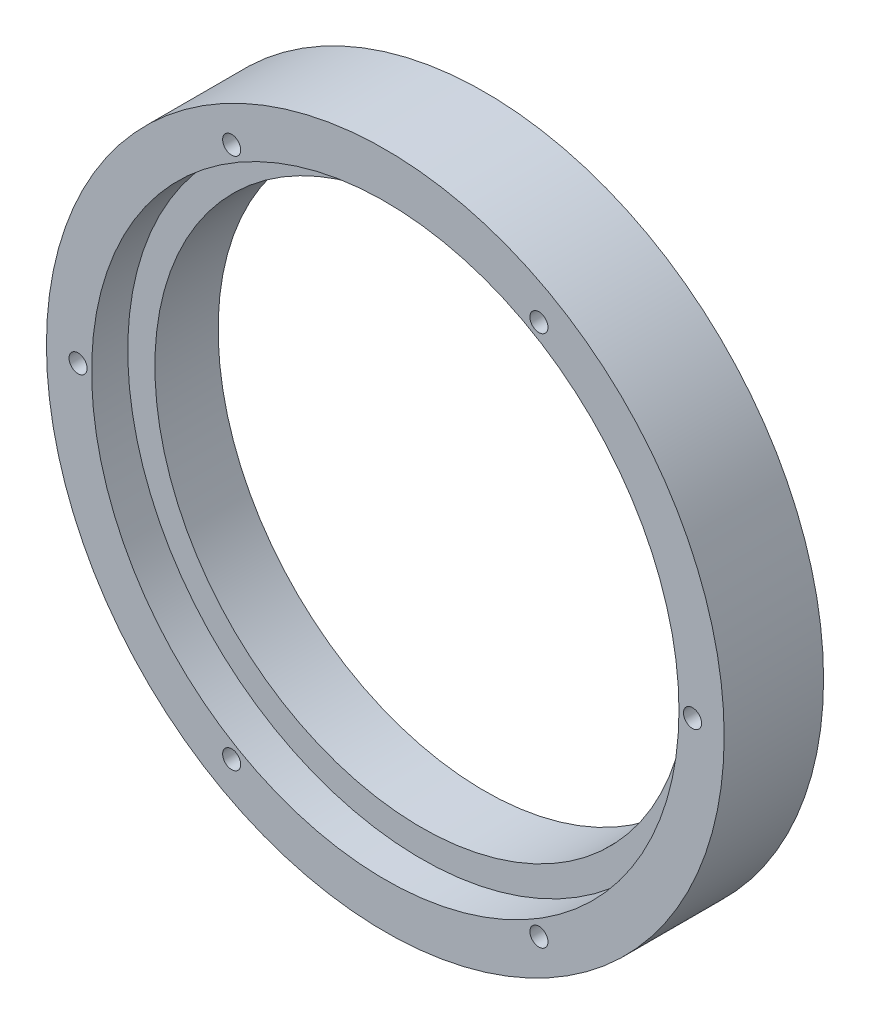
ISO-10303-21;
HEADER;
FILE_DESCRIPTION(('STEP AP214'),'2;1');
FILE_NAME('part.step','',(''),(''),'','','');
FILE_SCHEMA(('AUTOMOTIVE_DESIGN { 1 0 10303 214 1 1 1 1 }'));
ENDSEC;
DATA;
#1=APPLICATION_CONTEXT('core data for automotive mechanical design processes');
#2=APPLICATION_PROTOCOL_DEFINITION('international standard','automotive_design',2000,#1);
#3=PRODUCT_CONTEXT('',#1,'mechanical');
#4=PRODUCT('Part','Part','',(#3));
#5=PRODUCT_RELATED_PRODUCT_CATEGORY('part','',(#4));
#6=PRODUCT_DEFINITION_FORMATION('','',#4);
#7=PRODUCT_DEFINITION_CONTEXT('part definition',#1,'design');
#8=PRODUCT_DEFINITION('design','',#6,#7);
#9=PRODUCT_DEFINITION_SHAPE('','',#8);
#10=(LENGTH_UNIT() NAMED_UNIT(*) SI_UNIT(.MILLI.,.METRE.));
#11=(NAMED_UNIT(*) PLANE_ANGLE_UNIT() SI_UNIT($,.RADIAN.));
#12=(NAMED_UNIT(*) SI_UNIT($,.STERADIAN.) SOLID_ANGLE_UNIT());
#13=UNCERTAINTY_MEASURE_WITH_UNIT(LENGTH_MEASURE(1.E-05),#10,'distance_accuracy_value','');
#14=(GEOMETRIC_REPRESENTATION_CONTEXT(3) GLOBAL_UNCERTAINTY_ASSIGNED_CONTEXT((#13)) GLOBAL_UNIT_ASSIGNED_CONTEXT((#10,
#11,#12)) REPRESENTATION_CONTEXT('',''));
#15=CARTESIAN_POINT('',(0.,0.,0.));
#16=DIRECTION('',(0.,0.,1.));
#17=DIRECTION('',(1.,0.,0.));
#18=AXIS2_PLACEMENT_3D('',#15,#16,#17);
#19=CARTESIAN_POINT('',(0.,0.,11.));
#20=DIRECTION('',(0.,0.,-1.));
#21=DIRECTION('',(-1.,0.,0.));
#22=AXIS2_PLACEMENT_3D('',#19,#20,#21);
#23=CYLINDRICAL_SURFACE('',#22,29.5);
#24=CARTESIAN_POINT('',(0.,0.,0.));
#25=DIRECTION('',(0.,0.,1.));
#26=DIRECTION('',(1.,0.,0.));
#27=AXIS2_PLACEMENT_3D('',#24,#25,#26);
#28=CIRCLE('',#27,29.5);
#29=CARTESIAN_POINT('',(29.5,0.,0.));
#30=VERTEX_POINT('',#29);
#31=EDGE_CURVE('E47',#30,#30,#28,.T.);
#32=ORIENTED_EDGE('',*,*,#31,.F.);
#33=EDGE_LOOP('',(#32));
#34=FACE_BOUND('',#33,.T.);
#35=CARTESIAN_POINT('',(0.,0.,7.));
#36=DIRECTION('',(0.,0.,1.));
#37=DIRECTION('',(1.,0.,0.));
#38=AXIS2_PLACEMENT_3D('',#35,#36,#37);
#39=CIRCLE('',#38,29.5);
#40=CARTESIAN_POINT('',(29.5,0.,7.));
#41=VERTEX_POINT('',#40);
#42=EDGE_CURVE('E38',#41,#41,#39,.T.);
#43=ORIENTED_EDGE('',*,*,#42,.T.);
#44=EDGE_LOOP('',(#43));
#45=FACE_BOUND('',#44,.T.);
#46=ADVANCED_FACE('F34',(#34,#45),#23,.F.);
#47=CARTESIAN_POINT('',(0.,0.,11.));
#48=DIRECTION('',(0.,0.,1.));
#49=DIRECTION('',(1.,0.,0.));
#50=AXIS2_PLACEMENT_3D('',#47,#48,#49);
#51=PLANE('',#50);
#52=CARTESIAN_POINT('',(0.,0.,11.));
#53=DIRECTION('',(0.,0.,1.));
#54=DIRECTION('',(1.,0.,0.));
#55=AXIS2_PLACEMENT_3D('',#52,#53,#54);
#56=CIRCLE('',#55,32.5);
#57=CARTESIAN_POINT('',(32.5,0.,11.));
#58=VERTEX_POINT('',#57);
#59=EDGE_CURVE('E87',#58,#58,#56,.T.);
#60=ORIENTED_EDGE('',*,*,#59,.F.);
#61=EDGE_LOOP('',(#60));
#62=FACE_BOUND('',#61,.T.);
#63=CARTESIAN_POINT('',(34.,0.,11.));
#64=DIRECTION('',(0.,0.,-1.));
#65=DIRECTION('',(-1.,0.,0.));
#66=AXIS2_PLACEMENT_3D('',#63,#64,#65);
#67=CIRCLE('',#66,0.999999999999998);
#68=CARTESIAN_POINT('',(33.,0.,11.));
#69=VERTEX_POINT('',#68);
#70=EDGE_CURVE('E61',#69,#69,#67,.T.);
#71=ORIENTED_EDGE('',*,*,#70,.T.);
#72=EDGE_LOOP('',(#71));
#73=FACE_BOUND('',#72,.T.);
#74=CARTESIAN_POINT('',(17.0000000000001,-29.4448637286708,11.));
#75=DIRECTION('',(0.,0.,-1.));
#76=DIRECTION('',(-1.,0.,0.));
#77=AXIS2_PLACEMENT_3D('',#74,#75,#76);
#78=CIRCLE('',#77,1.);
#79=CARTESIAN_POINT('',(16.0000000000001,-29.4448637286708,11.));
#80=VERTEX_POINT('',#79);
#81=EDGE_CURVE('E67',#80,#80,#78,.T.);
#82=ORIENTED_EDGE('',*,*,#81,.T.);
#83=EDGE_LOOP('',(#82));
#84=FACE_BOUND('',#83,.T.);
#85=CARTESIAN_POINT('',(-17.0000000000002,-29.4448637286708,11.));
#86=DIRECTION('',(0.,0.,-1.));
#87=DIRECTION('',(-1.,0.,0.));
#88=AXIS2_PLACEMENT_3D('',#85,#86,#87);
#89=CIRCLE('',#88,1.);
#90=CARTESIAN_POINT('',(-18.0000000000002,-29.4448637286708,11.));
#91=VERTEX_POINT('',#90);
#92=EDGE_CURVE('E73',#91,#91,#89,.T.);
#93=ORIENTED_EDGE('',*,*,#92,.T.);
#94=EDGE_LOOP('',(#93));
#95=FACE_BOUND('',#94,.T.);
#96=CARTESIAN_POINT('',(-34.,0.,11.));
#97=DIRECTION('',(0.,0.,-1.));
#98=DIRECTION('',(-1.,0.,0.));
#99=AXIS2_PLACEMENT_3D('',#96,#97,#98);
#100=CIRCLE('',#99,0.999999999999998);
#101=CARTESIAN_POINT('',(-35.,0.,11.));
#102=VERTEX_POINT('',#101);
#103=EDGE_CURVE('E79',#102,#102,#100,.T.);
#104=ORIENTED_EDGE('',*,*,#103,.T.);
#105=EDGE_LOOP('',(#104));
#106=FACE_BOUND('',#105,.T.);
#107=CARTESIAN_POINT('',(-17.0000000000001,29.4448637286708,11.));
#108=DIRECTION('',(0.,0.,-1.));
#109=DIRECTION('',(-1.,0.,0.));
#110=AXIS2_PLACEMENT_3D('',#107,#108,#109);
#111=CIRCLE('',#110,1.00000000000001);
#112=CARTESIAN_POINT('',(-18.0000000000001,29.4448637286708,11.));
#113=VERTEX_POINT('',#112);
#114=EDGE_CURVE('E55',#113,#113,#111,.T.);
#115=ORIENTED_EDGE('',*,*,#114,.T.);
#116=EDGE_LOOP('',(#115));
#117=FACE_BOUND('',#116,.T.);
#118=CARTESIAN_POINT('',(17.0000000000001,29.4448637286708,11.));
#119=DIRECTION('',(0.,0.,-1.));
#120=DIRECTION('',(-1.,0.,0.));
#121=AXIS2_PLACEMENT_3D('',#118,#119,#120);
#122=CIRCLE('',#121,1.);
#123=CARTESIAN_POINT('',(16.0000000000001,29.4448637286708,11.));
#124=VERTEX_POINT('',#123);
#125=EDGE_CURVE('E51',#124,#124,#122,.T.);
#126=ORIENTED_EDGE('',*,*,#125,.T.);
#127=EDGE_LOOP('',(#126));
#128=FACE_BOUND('',#127,.T.);
#129=CARTESIAN_POINT('',(0.,0.,11.));
#130=DIRECTION('',(0.,0.,1.));
#131=DIRECTION('',(1.,0.,0.));
#132=AXIS2_PLACEMENT_3D('',#129,#130,#131);
#133=CIRCLE('',#132,37.5);
#134=CARTESIAN_POINT('',(37.5,0.,11.));
#135=VERTEX_POINT('',#134);
#136=EDGE_CURVE('E10',#135,#135,#133,.T.);
#137=ORIENTED_EDGE('',*,*,#136,.T.);
#138=EDGE_LOOP('',(#137));
#139=FACE_BOUND('',#138,.T.);
#140=ADVANCED_FACE('F109',(#62,#73,#84,#95,#106,#117,#128,#139),#51,.T.);
#141=CARTESIAN_POINT('',(0.,0.,0.));
#142=DIRECTION('',(0.,0.,1.));
#143=DIRECTION('',(1.,0.,0.));
#144=AXIS2_PLACEMENT_3D('',#141,#142,#143);
#145=PLANE('',#144);
#146=CARTESIAN_POINT('',(34.,0.,0.));
#147=DIRECTION('',(0.,0.,-1.));
#148=DIRECTION('',(-1.,0.,0.));
#149=AXIS2_PLACEMENT_3D('',#146,#147,#148);
#150=CIRCLE('',#149,0.999999999999998);
#151=CARTESIAN_POINT('',(33.,0.,0.));
#152=VERTEX_POINT('',#151);
#153=EDGE_CURVE('E58',#152,#152,#150,.T.);
#154=ORIENTED_EDGE('',*,*,#153,.F.);
#155=EDGE_LOOP('',(#154));
#156=FACE_BOUND('',#155,.T.);
#157=CARTESIAN_POINT('',(17.0000000000001,-29.4448637286708,0.));
#158=DIRECTION('',(0.,0.,-1.));
#159=DIRECTION('',(-1.,0.,0.));
#160=AXIS2_PLACEMENT_3D('',#157,#158,#159);
#161=CIRCLE('',#160,1.);
#162=CARTESIAN_POINT('',(16.0000000000001,-29.4448637286708,0.));
#163=VERTEX_POINT('',#162);
#164=EDGE_CURVE('E64',#163,#163,#161,.T.);
#165=ORIENTED_EDGE('',*,*,#164,.F.);
#166=EDGE_LOOP('',(#165));
#167=FACE_BOUND('',#166,.T.);
#168=CARTESIAN_POINT('',(-17.0000000000002,-29.4448637286708,0.));
#169=DIRECTION('',(0.,0.,-1.));
#170=DIRECTION('',(-1.,0.,0.));
#171=AXIS2_PLACEMENT_3D('',#168,#169,#170);
#172=CIRCLE('',#171,1.);
#173=CARTESIAN_POINT('',(-18.0000000000002,-29.4448637286708,0.));
#174=VERTEX_POINT('',#173);
#175=EDGE_CURVE('E70',#174,#174,#172,.T.);
#176=ORIENTED_EDGE('',*,*,#175,.F.);
#177=EDGE_LOOP('',(#176));
#178=FACE_BOUND('',#177,.T.);
#179=CARTESIAN_POINT('',(-34.,0.,0.));
#180=DIRECTION('',(0.,0.,-1.));
#181=DIRECTION('',(-1.,0.,0.));
#182=AXIS2_PLACEMENT_3D('',#179,#180,#181);
#183=CIRCLE('',#182,0.999999999999998);
#184=CARTESIAN_POINT('',(-35.,0.,0.));
#185=VERTEX_POINT('',#184);
#186=EDGE_CURVE('E76',#185,#185,#183,.T.);
#187=ORIENTED_EDGE('',*,*,#186,.F.);
#188=EDGE_LOOP('',(#187));
#189=FACE_BOUND('',#188,.T.);
#190=CARTESIAN_POINT('',(-17.0000000000001,29.4448637286708,0.));
#191=DIRECTION('',(0.,0.,-1.));
#192=DIRECTION('',(-1.,0.,0.));
#193=AXIS2_PLACEMENT_3D('',#190,#191,#192);
#194=CIRCLE('',#193,1.00000000000001);
#195=CARTESIAN_POINT('',(-18.0000000000001,29.4448637286708,0.));
#196=VERTEX_POINT('',#195);
#197=EDGE_CURVE('E82',#196,#196,#194,.T.);
#198=ORIENTED_EDGE('',*,*,#197,.F.);
#199=EDGE_LOOP('',(#198));
#200=FACE_BOUND('',#199,.T.);
#201=CARTESIAN_POINT('',(17.0000000000001,29.4448637286708,0.));
#202=DIRECTION('',(0.,0.,-1.));
#203=DIRECTION('',(-1.,0.,0.));
#204=AXIS2_PLACEMENT_3D('',#201,#202,#203);
#205=CIRCLE('',#204,1.);
#206=CARTESIAN_POINT('',(16.0000000000001,29.4448637286708,0.));
#207=VERTEX_POINT('',#206);
#208=EDGE_CURVE('E52',#207,#207,#205,.T.);
#209=ORIENTED_EDGE('',*,*,#208,.F.);
#210=EDGE_LOOP('',(#209));
#211=FACE_BOUND('',#210,.T.);
#212=CARTESIAN_POINT('',(0.,0.,0.));
#213=DIRECTION('',(0.,0.,1.));
#214=DIRECTION('',(1.,0.,0.));
#215=AXIS2_PLACEMENT_3D('',#212,#213,#214);
#216=CIRCLE('',#215,37.5);
#217=CARTESIAN_POINT('',(37.5,0.,0.));
#218=VERTEX_POINT('',#217);
#219=EDGE_CURVE('E42',#218,#218,#216,.T.);
#220=ORIENTED_EDGE('',*,*,#219,.F.);
#221=EDGE_LOOP('',(#220));
#222=FACE_BOUND('',#221,.T.);
#223=ORIENTED_EDGE('',*,*,#31,.T.);
#224=EDGE_LOOP('',(#223));
#225=FACE_BOUND('',#224,.T.);
#226=ADVANCED_FACE('F115',(#156,#167,#178,#189,#200,#211,#222,#225),#145,.F.);
#227=CARTESIAN_POINT('',(0.,0.,11.));
#228=DIRECTION('',(0.,0.,-1.));
#229=DIRECTION('',(-1.,0.,0.));
#230=AXIS2_PLACEMENT_3D('',#227,#228,#229);
#231=CYLINDRICAL_SURFACE('',#230,37.5);
#232=ORIENTED_EDGE('',*,*,#136,.F.);
#233=EDGE_LOOP('',(#232));
#234=FACE_BOUND('',#233,.T.);
#235=ORIENTED_EDGE('',*,*,#219,.T.);
#236=EDGE_LOOP('',(#235));
#237=FACE_BOUND('',#236,.T.);
#238=ADVANCED_FACE('F36',(#234,#237),#231,.T.);
#239=CARTESIAN_POINT('',(17.0000000000001,29.4448637286708,11.));
#240=DIRECTION('',(0.,0.,-1.));
#241=DIRECTION('',(-1.,0.,0.));
#242=AXIS2_PLACEMENT_3D('',#239,#240,#241);
#243=CYLINDRICAL_SURFACE('',#242,1.);
#244=ORIENTED_EDGE('',*,*,#125,.F.);
#245=EDGE_LOOP('',(#244));
#246=FACE_BOUND('',#245,.T.);
#247=ORIENTED_EDGE('',*,*,#208,.T.);
#248=EDGE_LOOP('',(#247));
#249=FACE_BOUND('',#248,.T.);
#250=ADVANCED_FACE('F120',(#246,#249),#243,.F.);
#251=CARTESIAN_POINT('',(-17.0000000000001,29.4448637286708,11.));
#252=DIRECTION('',(0.,0.,-1.));
#253=DIRECTION('',(-1.,0.,0.));
#254=AXIS2_PLACEMENT_3D('',#251,#252,#253);
#255=CYLINDRICAL_SURFACE('',#254,1.00000000000001);
#256=ORIENTED_EDGE('',*,*,#114,.F.);
#257=EDGE_LOOP('',(#256));
#258=FACE_BOUND('',#257,.T.);
#259=ORIENTED_EDGE('',*,*,#197,.T.);
#260=EDGE_LOOP('',(#259));
#261=FACE_BOUND('',#260,.T.);
#262=ADVANCED_FACE('F145',(#258,#261),#255,.F.);
#263=CARTESIAN_POINT('',(-34.,0.,11.));
#264=DIRECTION('',(0.,0.,-1.));
#265=DIRECTION('',(-1.,0.,0.));
#266=AXIS2_PLACEMENT_3D('',#263,#264,#265);
#267=CYLINDRICAL_SURFACE('',#266,0.999999999999998);
#268=ORIENTED_EDGE('',*,*,#103,.F.);
#269=EDGE_LOOP('',(#268));
#270=FACE_BOUND('',#269,.T.);
#271=ORIENTED_EDGE('',*,*,#186,.T.);
#272=EDGE_LOOP('',(#271));
#273=FACE_BOUND('',#272,.T.);
#274=ADVANCED_FACE('F150',(#270,#273),#267,.F.);
#275=CARTESIAN_POINT('',(-17.0000000000002,-29.4448637286708,11.));
#276=DIRECTION('',(0.,0.,-1.));
#277=DIRECTION('',(-1.,0.,0.));
#278=AXIS2_PLACEMENT_3D('',#275,#276,#277);
#279=CYLINDRICAL_SURFACE('',#278,1.);
#280=ORIENTED_EDGE('',*,*,#92,.F.);
#281=EDGE_LOOP('',(#280));
#282=FACE_BOUND('',#281,.T.);
#283=ORIENTED_EDGE('',*,*,#175,.T.);
#284=EDGE_LOOP('',(#283));
#285=FACE_BOUND('',#284,.T.);
#286=ADVANCED_FACE('F158',(#282,#285),#279,.F.);
#287=CARTESIAN_POINT('',(17.0000000000001,-29.4448637286708,11.));
#288=DIRECTION('',(0.,0.,-1.));
#289=DIRECTION('',(-1.,0.,0.));
#290=AXIS2_PLACEMENT_3D('',#287,#288,#289);
#291=CYLINDRICAL_SURFACE('',#290,1.);
#292=ORIENTED_EDGE('',*,*,#81,.F.);
#293=EDGE_LOOP('',(#292));
#294=FACE_BOUND('',#293,.T.);
#295=ORIENTED_EDGE('',*,*,#164,.T.);
#296=EDGE_LOOP('',(#295));
#297=FACE_BOUND('',#296,.T.);
#298=ADVANCED_FACE('F166',(#294,#297),#291,.F.);
#299=CARTESIAN_POINT('',(34.,0.,11.));
#300=DIRECTION('',(0.,0.,-1.));
#301=DIRECTION('',(-1.,0.,0.));
#302=AXIS2_PLACEMENT_3D('',#299,#300,#301);
#303=CYLINDRICAL_SURFACE('',#302,0.999999999999998);
#304=ORIENTED_EDGE('',*,*,#70,.F.);
#305=EDGE_LOOP('',(#304));
#306=FACE_BOUND('',#305,.T.);
#307=ORIENTED_EDGE('',*,*,#153,.T.);
#308=EDGE_LOOP('',(#307));
#309=FACE_BOUND('',#308,.T.);
#310=ADVANCED_FACE('F105',(#306,#309),#303,.F.);
#311=CARTESIAN_POINT('',(0.,0.,7.));
#312=DIRECTION('',(0.,0.,1.));
#313=DIRECTION('',(1.,0.,0.));
#314=AXIS2_PLACEMENT_3D('',#311,#312,#313);
#315=CYLINDRICAL_SURFACE('',#314,32.5);
#316=CARTESIAN_POINT('',(0.,0.,7.));
#317=DIRECTION('',(0.,0.,1.));
#318=DIRECTION('',(1.,0.,0.));
#319=AXIS2_PLACEMENT_3D('',#316,#317,#318);
#320=CIRCLE('',#319,32.5);
#321=CARTESIAN_POINT('',(32.5,0.,7.));
#322=VERTEX_POINT('',#321);
#323=EDGE_CURVE('E90',#322,#322,#320,.T.);
#324=ORIENTED_EDGE('',*,*,#323,.F.);
#325=EDGE_LOOP('',(#324));
#326=FACE_BOUND('',#325,.T.);
#327=ORIENTED_EDGE('',*,*,#59,.T.);
#328=EDGE_LOOP('',(#327));
#329=FACE_BOUND('',#328,.T.);
#330=ADVANCED_FACE('F100',(#326,#329),#315,.F.);
#331=CARTESIAN_POINT('',(0.,0.,7.));
#332=DIRECTION('',(0.,0.,1.));
#333=DIRECTION('',(1.,0.,0.));
#334=AXIS2_PLACEMENT_3D('',#331,#332,#333);
#335=PLANE('',#334);
#336=ORIENTED_EDGE('',*,*,#42,.F.);
#337=EDGE_LOOP('',(#336));
#338=FACE_BOUND('',#337,.T.);
#339=ORIENTED_EDGE('',*,*,#323,.T.);
#340=EDGE_LOOP('',(#339));
#341=FACE_BOUND('',#340,.T.);
#342=ADVANCED_FACE('F98',(#338,#341),#335,.T.);
#343=CLOSED_SHELL('',(#46,#140,#226,#238,#250,#262,#274,#286,#298,#310,#330,#342));
#344=MANIFOLD_SOLID_BREP('B2',#343);
#345=ADVANCED_BREP_SHAPE_REPRESENTATION('',(#18,#344),#14);
#346=SHAPE_DEFINITION_REPRESENTATION(#9,#345);
ENDSEC;
END-ISO-10303-21;
